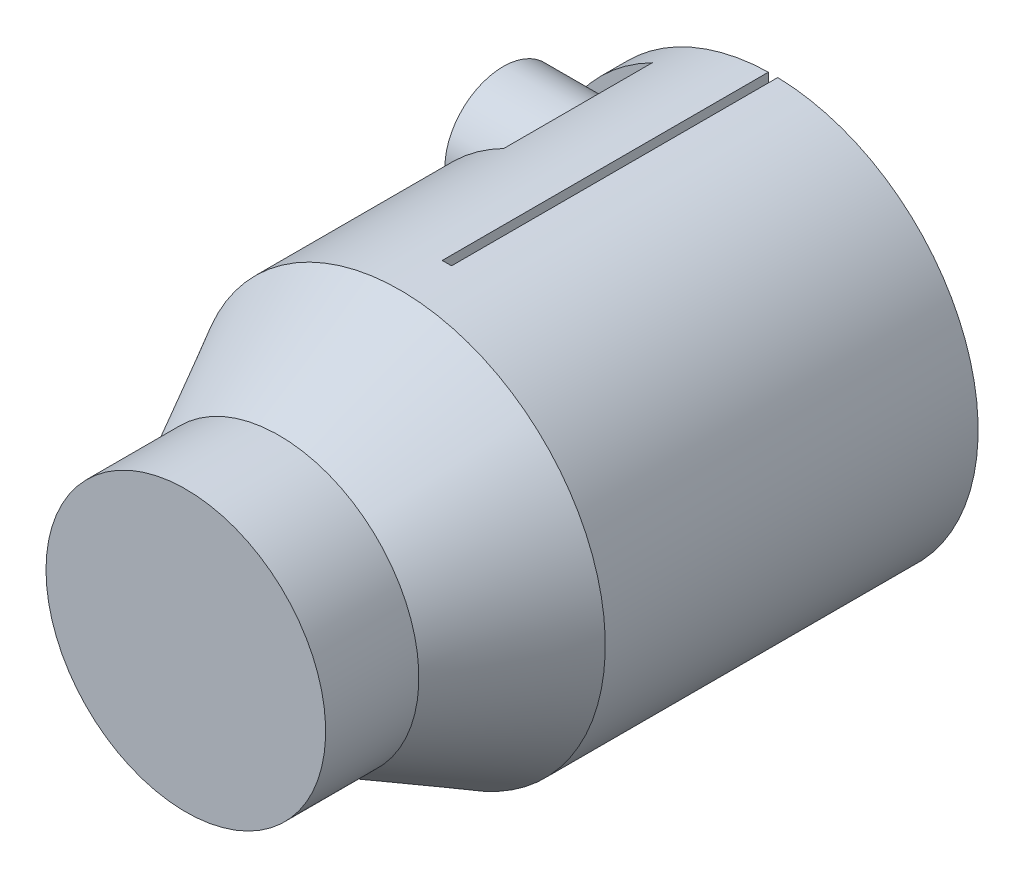
ISO-10303-21;
HEADER;
FILE_DESCRIPTION(('STEP AP214'),'2;1');
FILE_NAME('part.step','',(''),(''),'','','');
FILE_SCHEMA(('AUTOMOTIVE_DESIGN { 1 0 10303 214 1 1 1 1 }'));
ENDSEC;
DATA;
#1=APPLICATION_CONTEXT('core data for automotive mechanical design processes');
#2=APPLICATION_PROTOCOL_DEFINITION('international standard','automotive_design',2000,#1);
#3=PRODUCT_CONTEXT('',#1,'mechanical');
#4=PRODUCT('Part','Part','',(#3));
#5=PRODUCT_RELATED_PRODUCT_CATEGORY('part','',(#4));
#6=PRODUCT_DEFINITION_FORMATION('','',#4);
#7=PRODUCT_DEFINITION_CONTEXT('part definition',#1,'design');
#8=PRODUCT_DEFINITION('design','',#6,#7);
#9=PRODUCT_DEFINITION_SHAPE('','',#8);
#10=(LENGTH_UNIT() NAMED_UNIT(*) SI_UNIT(.MILLI.,.METRE.));
#11=(NAMED_UNIT(*) PLANE_ANGLE_UNIT() SI_UNIT($,.RADIAN.));
#12=(NAMED_UNIT(*) SI_UNIT($,.STERADIAN.) SOLID_ANGLE_UNIT());
#13=UNCERTAINTY_MEASURE_WITH_UNIT(LENGTH_MEASURE(1.E-05),#10,'distance_accuracy_value','');
#14=(GEOMETRIC_REPRESENTATION_CONTEXT(3) GLOBAL_UNCERTAINTY_ASSIGNED_CONTEXT((#13)) GLOBAL_UNIT_ASSIGNED_CONTEXT((#10,
#11,#12)) REPRESENTATION_CONTEXT('',''));
#15=CARTESIAN_POINT('',(0.,0.,0.));
#16=DIRECTION('',(0.,0.,1.));
#17=DIRECTION('',(1.,0.,0.));
#18=AXIS2_PLACEMENT_3D('',#15,#16,#17);
#19=CARTESIAN_POINT('',(22.,0.,0.));
#20=DIRECTION('',(0.,0.,-1.));
#21=DIRECTION('',(-1.,0.,0.));
#22=AXIS2_PLACEMENT_3D('',#19,#20,#21);
#23=CYLINDRICAL_SURFACE('',#22,22.);
#24=DIRECTION('',(0.,0.,-1.));
#25=VECTOR('',#24,1.);
#26=CARTESIAN_POINT('',(22.5,21.9943174479228,0.));
#27=LINE('',#26,#25);
#28=CARTESIAN_POINT('',(22.5,21.9943174479228,35.));
#29=VERTEX_POINT('',#28);
#30=CARTESIAN_POINT('',(22.5,21.9943174479228,0.));
#31=VERTEX_POINT('',#30);
#32=EDGE_CURVE('E290',#29,#31,#27,.T.);
#33=ORIENTED_EDGE('',*,*,#32,.F.);
#34=CARTESIAN_POINT('',(22.,0.,35.));
#35=DIRECTION('',(0.,0.,1.));
#36=DIRECTION('',(1.,0.,0.));
#37=AXIS2_PLACEMENT_3D('',#34,#35,#36);
#38=CIRCLE('',#37,22.);
#39=CARTESIAN_POINT('',(21.5,21.9943174479228,35.));
#40=VERTEX_POINT('',#39);
#41=EDGE_CURVE('E283',#40,#29,#38,.F.);
#42=ORIENTED_EDGE('',*,*,#41,.F.);
#43=DIRECTION('',(0.,0.,-1.));
#44=VECTOR('',#43,1.);
#45=CARTESIAN_POINT('',(21.5,21.9943174479228,0.));
#46=LINE('',#45,#44);
#47=CARTESIAN_POINT('',(21.5,21.9943174479228,0.));
#48=VERTEX_POINT('',#47);
#49=EDGE_CURVE('E286',#48,#40,#46,.F.);
#50=ORIENTED_EDGE('',*,*,#49,.F.);
#51=CARTESIAN_POINT('',(22.,0.,0.));
#52=DIRECTION('',(0.,0.,-1.));
#53=DIRECTION('',(-1.,0.,0.));
#54=AXIS2_PLACEMENT_3D('',#51,#52,#53);
#55=CIRCLE('',#54,22.);
#56=EDGE_CURVE('E271',#31,#48,#55,.T.);
#57=ORIENTED_EDGE('',*,*,#56,.F.);
#58=EDGE_LOOP('',(#33,#42,#50,#57));
#59=FACE_BOUND('',#58,.T.);
#60=CARTESIAN_POINT('',(22.,0.,40.));
#61=DIRECTION('',(0.,0.,-1.));
#62=DIRECTION('',(-1.,0.,0.));
#63=AXIS2_PLACEMENT_3D('',#60,#61,#62);
#64=CIRCLE('',#63,22.);
#65=CARTESIAN_POINT('',(0.,0.,40.));
#66=VERTEX_POINT('',#65);
#67=EDGE_CURVE('E267',#66,#66,#64,.T.);
#68=ORIENTED_EDGE('',*,*,#67,.T.);
#69=EDGE_LOOP('',(#68));
#70=FACE_BOUND('',#69,.T.);
#71=CARTESIAN_POINT('',(22.,0.,18.8950646377356));
#72=DIRECTION('',(0.,0.,-1.));
#73=DIRECTION('',(-1.,0.,0.));
#74=AXIS2_PLACEMENT_3D('',#71,#72,#73);
#75=CIRCLE('',#74,22.);
#76=CARTESIAN_POINT('',(12.,19.5959179422654,18.8950646377356));
#77=VERTEX_POINT('',#76);
#78=CARTESIAN_POINT('',(3.56223858134803,12.0020395712091,18.8950646377356));
#79=VERTEX_POINT('',#78);
#80=EDGE_CURVE('E296',#77,#79,#75,.F.);
#81=ORIENTED_EDGE('',*,*,#80,.T.);
#82=CARTESIAN_POINT('',(3.56223858134803,12.0020395712091,18.8950646377356));
#83=CARTESIAN_POINT('',(3.42984916370471,11.7987247659707,18.8696720212076));
#84=CARTESIAN_POINT('',(3.30130799139479,11.5938382201092,18.8361055566972));
#85=CARTESIAN_POINT('',(3.05242442245975,11.1824331225042,18.7517832631057));
#86=CARTESIAN_POINT('',(2.93208799358666,10.975913502249,18.7010150791766));
#87=CARTESIAN_POINT('',(2.69993492835798,10.5623857842971,18.5812892358979));
#88=CARTESIAN_POINT('',(2.58814700469477,10.3553782578138,18.5122734727424));
#89=CARTESIAN_POINT('',(2.37402617966339,9.94358914281965,18.3555959387874));
#90=CARTESIAN_POINT('',(2.27169100214241,9.73880702897969,18.2679386736025));
#91=CARTESIAN_POINT('',(2.07631465659705,9.33262044797644,18.0732267744861));
#92=CARTESIAN_POINT('',(1.98332056806612,9.13123696914421,17.9660808534114));
#93=CARTESIAN_POINT('',(1.80734653173127,8.73519937733571,17.7327353546143));
#94=CARTESIAN_POINT('',(1.72436747017884,8.5405458609944,17.6065340928647));
#95=CARTESIAN_POINT('',(1.56856656838172,8.16079483211427,17.3358162643469));
#96=CARTESIAN_POINT('',(1.4957234664592,7.97567784550534,17.1913392880179));
#97=CARTESIAN_POINT('',(1.35976135584986,7.6169124074791,16.8846733334175));
#98=CARTESIAN_POINT('',(1.29664133514101,7.4432627635655,16.7224862015057));
#99=CARTESIAN_POINT('',(1.18490560676272,7.12445146449219,16.3966874905089));
#100=CARTESIAN_POINT('',(1.13549984024265,6.97812924129825,16.2344795323216));
#101=CARTESIAN_POINT('',(1.04401033591964,6.69836997797281,15.8973892240503));
#102=CARTESIAN_POINT('',(1.00192619651111,6.5649322312813,15.7225075698891));
#103=CARTESIAN_POINT('',(0.924585261417395,6.31223989636348,15.3612107988862));
#104=CARTESIAN_POINT('',(0.889332294814257,6.19299327706533,15.1747892903991));
#105=CARTESIAN_POINT('',(0.825178845431487,5.96995997839484,14.7918764597282));
#106=CARTESIAN_POINT('',(0.796278338732741,5.86617324081139,14.5953851754638));
#107=CARTESIAN_POINT('',(0.745130836523064,5.67800599345516,14.1999945999284));
#108=CARTESIAN_POINT('',(0.722706524344409,5.59312674966742,14.0013552936403));
#109=CARTESIAN_POINT('',(0.682927563285331,5.43955164379563,13.5973402766854));
#110=CARTESIAN_POINT('',(0.665574759601739,5.37086167370558,13.3919621443452));
#111=CARTESIAN_POINT('',(0.635592938400196,5.25033035180947,12.9761233804645));
#112=CARTESIAN_POINT('',(0.622961008928325,5.19847861635303,12.7656659675319));
#113=CARTESIAN_POINT('',(0.602110567853958,5.11197716378334,12.340931251484));
#114=CARTESIAN_POINT('',(0.593894064791938,5.07733527582584,12.126652255676));
#115=CARTESIAN_POINT('',(0.581648374412549,5.02542843868485,11.6946730600962));
#116=CARTESIAN_POINT('',(0.577642682309074,5.00826100904073,11.4769604723564));
#117=CARTESIAN_POINT('',(0.573797711474712,4.99178597459808,11.0409219007499));
#118=CARTESIAN_POINT('',(0.573956572904074,4.99247039737529,10.8225962342331));
#119=CARTESIAN_POINT('',(0.578441373980471,5.01167865676666,10.3866635701479));
#120=CARTESIAN_POINT('',(0.582769408326811,5.03021146086386,10.1690569890155));
#121=CARTESIAN_POINT('',(0.595703888514974,5.08496776727002,9.73629232964482));
#122=CARTESIAN_POINT('',(0.604308731083153,5.12118464015294,9.52113336474729));
#123=CARTESIAN_POINT('',(0.626048271275328,5.21117413541157,9.09391096768385));
#124=CARTESIAN_POINT('',(0.639199715986966,5.26501162245648,8.88186204424169));
#125=CARTESIAN_POINT('',(0.670331700307662,5.38974750690636,8.46320500433935));
#126=CARTESIAN_POINT('',(0.688312251206693,5.46064594419811,8.25659690060051));
#127=CARTESIAN_POINT('',(0.729483495935026,5.61887936010449,7.85032725241451));
#128=CARTESIAN_POINT('',(0.752673788469355,5.70621307266186,7.6506651742975));
#129=CARTESIAN_POINT('',(0.804703409745069,5.89653529601973,7.25971393730735));
#130=CARTESIAN_POINT('',(0.833542698373498,5.99952369565669,7.06842471899117));
#131=CARTESIAN_POINT('',(0.897176716515441,6.21963827368197,6.6965398235787));
#132=CARTESIAN_POINT('',(0.931940456953628,6.3366899957852,6.5158947721063));
#133=CARTESIAN_POINT('',(1.00798611973251,6.5842319383203,6.16551476089705));
#134=CARTESIAN_POINT('',(1.04926800050181,6.71472207304281,5.99577973158798));
#135=CARTESIAN_POINT('',(1.13877681875256,6.98784717386907,5.66838689999571));
#136=CARTESIAN_POINT('',(1.18700267305319,7.1304802443973,5.51072721996053));
#137=CARTESIAN_POINT('',(1.29077875319465,7.42648938239762,5.20844714308874));
#138=CARTESIAN_POINT('',(1.34632895108119,7.57986540886681,5.06382669648979));
#139=CARTESIAN_POINT('',(1.46484387525406,7.89529263312869,4.78889452836025));
#140=CARTESIAN_POINT('',(1.52778320481087,8.05731312926313,4.65853660757922));
#141=CARTESIAN_POINT('',(1.66140388275251,8.38888854246947,4.41217314663342));
#142=CARTESIAN_POINT('',(1.73208520602999,8.55844343510619,4.29616755992652));
#143=CARTESIAN_POINT('',(1.88125777920852,8.90345609419582,4.07887528410194));
#144=CARTESIAN_POINT('',(1.9597496093537,9.07891429856509,3.97758968991282));
#145=CARTESIAN_POINT('',(2.12447914988019,9.43408670762869,3.78989626175536));
#146=CARTESIAN_POINT('',(2.21071691514845,9.61380094247418,3.70348853322278));
#147=CARTESIAN_POINT('',(2.39410538973551,9.98262806973082,3.54255149536163));
#148=CARTESIAN_POINT('',(2.49154214215537,10.1718424037963,3.46858128714647));
#149=CARTESIAN_POINT('',(2.69426228665945,10.5515314085004,3.33626263666899));
#150=CARTESIAN_POINT('',(2.79954647301394,10.7420062049328,3.27791577846081));
#151=CARTESIAN_POINT('',(3.01755727960109,11.122724165276,3.17635572579952));
#152=CARTESIAN_POINT('',(3.13028431556015,11.3129673156425,3.13314337754808));
#153=CARTESIAN_POINT('',(3.36268231875591,11.6918680044669,3.06122245230201));
#154=CARTESIAN_POINT('',(3.48235154992991,11.8805259259542,3.03251026647592));
#155=CARTESIAN_POINT('',(3.70813354040176,12.224679830949,2.99238339557038));
#156=CARTESIAN_POINT('',(3.81328285944319,12.3805758204604,2.97891405498808));
#157=CARTESIAN_POINT('',(4.02751297825754,12.6895648667716,2.96115443194715));
#158=CARTESIAN_POINT('',(4.13658260312914,12.8426642645159,2.95683988292032));
#159=CARTESIAN_POINT('',(4.24759976615529,12.9943174479228,2.9568416240263));
#160=B_SPLINE_CURVE_WITH_KNOTS('',3,(#82,#83,#84,#85,#86,#87,#88,#89,#90,#91,#92,#93,#94,#95,
#96,#97,#98,#99,#100,#101,#102,#103,#104,#105,#106,#107,#108,#109,#110,#111,#112,#113,#114,#115,
#116,#117,#118,#119,#120,#121,#122,#123,#124,#125,#126,#127,#128,#129,#130,#131,#132,#133,#134,
#135,#136,#137,#138,#139,#140,#141,#142,#143,#144,#145,#146,#147,#148,#149,#150,#151,#152,#153,
#154,#155,#156,#157,#158,#159),.UNSPECIFIED.,.F.,.F.,(4,2,2,2,2,2,2,2,2,2,2,2,2,2,2,2,2,2,2,2,2,
2,2,2,2,2,2,2,2,2,2,2,2,2,2,2,2,2,4),(0.,0.731769595797977,1.46406589094635,2.19872264324119,
2.93320203183385,3.67121481442704,4.40929285756396,5.14579854872543,5.88222752918739,
6.55330516225114,7.22434597377798,7.89576184307923,8.5671751842341,9.2179358956807,
9.8689330833136,10.5195280541515,11.1704187252078,11.8249222232623,12.4791334328713,
13.1336735064844,13.7879683934575,14.4446994703426,15.1014320826136,15.7581141255462,
16.4147915056143,17.0681338897009,17.721472107069,18.3747085212973,19.0279424424376,
19.6789935127648,20.3300424717903,20.9811398335341,21.6322418092546,22.3074811293338,
22.9827888861421,23.6581343947745,24.3333117390354,24.8986037095967,25.4623953814796),.UNSPECIFIED.);
#161=CARTESIAN_POINT('',(4.24759976615529,12.9943174479228,2.9568416240263));
#162=VERTEX_POINT('',#161);
#163=EDGE_CURVE('E51',#79,#162,#160,.T.);
#164=ORIENTED_EDGE('',*,*,#163,.T.);
#165=CARTESIAN_POINT('',(22.,0.,2.9568416240263));
#166=DIRECTION('',(0.,0.,1.));
#167=DIRECTION('',(1.,0.,0.));
#168=AXIS2_PLACEMENT_3D('',#165,#166,#167);
#169=CIRCLE('',#168,22.);
#170=CARTESIAN_POINT('',(12.,19.5959179422654,2.9568416240263));
#171=VERTEX_POINT('',#170);
#172=EDGE_CURVE('E300',#162,#171,#169,.F.);
#173=ORIENTED_EDGE('',*,*,#172,.T.);
#174=DIRECTION('',(0.,0.,-1.));
#175=VECTOR('',#174,1.);
#176=CARTESIAN_POINT('',(12.,19.5959179422654,0.));
#177=LINE('',#176,#175);
#178=EDGE_CURVE('E293',#77,#171,#177,.T.);
#179=ORIENTED_EDGE('',*,*,#178,.F.);
#180=EDGE_LOOP('',(#81,#164,#173,#179));
#181=FACE_BOUND('',#180,.T.);
#182=ADVANCED_FACE('F41',(#59,#70,#181),#23,.T.);
#183=CARTESIAN_POINT('',(0.,0.,40.));
#184=DIRECTION('',(0.,0.,1.));
#185=DIRECTION('',(1.,0.,0.));
#186=AXIS2_PLACEMENT_3D('',#183,#184,#185);
#187=PLANE('',#186);
#188=CARTESIAN_POINT('',(22.,0.,40.));
#189=DIRECTION('',(0.,0.,-1.));
#190=DIRECTION('',(-1.,0.,0.));
#191=AXIS2_PLACEMENT_3D('',#188,#189,#190);
#192=CIRCLE('',#191,7.);
#193=CARTESIAN_POINT('',(15.,0.,40.));
#194=VERTEX_POINT('',#193);
#195=EDGE_CURVE('E279',#194,#194,#192,.T.);
#196=ORIENTED_EDGE('',*,*,#195,.T.);
#197=EDGE_LOOP('',(#196));
#198=FACE_BOUND('',#197,.T.);
#199=ADVANCED_FACE('F43',(#198),#187,.F.);
#200=CARTESIAN_POINT('',(22.,0.,0.));
#201=DIRECTION('',(0.,0.,-1.));
#202=DIRECTION('',(-1.,0.,0.));
#203=AXIS2_PLACEMENT_3D('',#200,#201,#202);
#204=CYLINDRICAL_SURFACE('',#203,7.);
#205=ORIENTED_EDGE('',*,*,#195,.F.);
#206=EDGE_LOOP('',(#205));
#207=FACE_BOUND('',#206,.T.);
#208=CARTESIAN_POINT('',(22.,0.,35.));
#209=DIRECTION('',(0.,0.,1.));
#210=DIRECTION('',(1.,0.,0.));
#211=AXIS2_PLACEMENT_3D('',#208,#209,#210);
#212=CIRCLE('',#211,7.);
#213=CARTESIAN_POINT('',(21.5,6.98212002188447,35.));
#214=VERTEX_POINT('',#213);
#215=CARTESIAN_POINT('',(22.5,6.98212002188447,35.));
#216=VERTEX_POINT('',#215);
#217=EDGE_CURVE('E243',#214,#216,#212,.F.);
#218=ORIENTED_EDGE('',*,*,#217,.T.);
#219=DIRECTION('',(0.,0.,-1.));
#220=VECTOR('',#219,1.);
#221=CARTESIAN_POINT('',(22.5,6.98212002188447,0.));
#222=LINE('',#221,#220);
#223=CARTESIAN_POINT('',(22.5,6.98212002188447,0.));
#224=VERTEX_POINT('',#223);
#225=EDGE_CURVE('E255',#216,#224,#222,.T.);
#226=ORIENTED_EDGE('',*,*,#225,.T.);
#227=CARTESIAN_POINT('',(22.,0.,0.));
#228=DIRECTION('',(0.,0.,-1.));
#229=DIRECTION('',(-1.,0.,0.));
#230=AXIS2_PLACEMENT_3D('',#227,#228,#229);
#231=CIRCLE('',#230,7.);
#232=CARTESIAN_POINT('',(21.5,6.98212002188447,0.));
#233=VERTEX_POINT('',#232);
#234=EDGE_CURVE('E275',#224,#233,#231,.T.);
#235=ORIENTED_EDGE('',*,*,#234,.T.);
#236=DIRECTION('',(0.,0.,-1.));
#237=VECTOR('',#236,1.);
#238=CARTESIAN_POINT('',(21.5,6.98212002188447,0.));
#239=LINE('',#238,#237);
#240=EDGE_CURVE('E251',#233,#214,#239,.F.);
#241=ORIENTED_EDGE('',*,*,#240,.T.);
#242=EDGE_LOOP('',(#218,#226,#235,#241));
#243=FACE_BOUND('',#242,.T.);
#244=ADVANCED_FACE('F349',(#207,#243),#204,.F.);
#245=CARTESIAN_POINT('',(0.,0.,0.));
#246=DIRECTION('',(0.,0.,1.));
#247=DIRECTION('',(1.,0.,0.));
#248=AXIS2_PLACEMENT_3D('',#245,#246,#247);
#249=PLANE('',#248);
#250=ORIENTED_EDGE('',*,*,#234,.F.);
#251=DIRECTION('',(0.,-1.,0.));
#252=VECTOR('',#251,1.);
#253=CARTESIAN_POINT('',(22.5,5.02484007666498,0.));
#254=LINE('',#253,#252);
#255=EDGE_CURVE('E234',#31,#224,#254,.T.);
#256=ORIENTED_EDGE('',*,*,#255,.F.);
#257=ORIENTED_EDGE('',*,*,#56,.T.);
#258=DIRECTION('',(0.,1.,0.));
#259=VECTOR('',#258,1.);
#260=CARTESIAN_POINT('',(21.5,5.02484007666498,0.));
#261=LINE('',#260,#259);
#262=EDGE_CURVE('E240',#233,#48,#261,.T.);
#263=ORIENTED_EDGE('',*,*,#262,.F.);
#264=EDGE_LOOP('',(#250,#256,#257,#263));
#265=FACE_BOUND('',#264,.T.);
#266=ADVANCED_FACE('F344',(#265),#249,.F.);
#267=CARTESIAN_POINT('',(22.,0.,40.));
#268=DIRECTION('',(0.,0.,-1.));
#269=DIRECTION('',(-1.,0.,0.));
#270=AXIS2_PLACEMENT_3D('',#267,#268,#269);
#271=CONICAL_SURFACE('',#270,22.,0.493941368919581);
#272=CARTESIAN_POINT('',(22.,0.,53.));
#273=DIRECTION('',(0.,0.,-1.));
#274=DIRECTION('',(-1.,0.,0.));
#275=AXIS2_PLACEMENT_3D('',#272,#273,#274);
#276=CIRCLE('',#275,15.);
#277=CARTESIAN_POINT('',(7.00000000000001,0.,53.));
#278=VERTEX_POINT('',#277);
#279=EDGE_CURVE('E263',#278,#278,#276,.T.);
#280=ORIENTED_EDGE('',*,*,#279,.T.);
#281=EDGE_LOOP('',(#280));
#282=FACE_BOUND('',#281,.T.);
#283=ORIENTED_EDGE('',*,*,#67,.F.);
#284=EDGE_LOOP('',(#283));
#285=FACE_BOUND('',#284,.T.);
#286=ADVANCED_FACE('F341',(#282,#285),#271,.T.);
#287=CARTESIAN_POINT('',(22.,0.,0.));
#288=DIRECTION('',(0.,0.,-1.));
#289=DIRECTION('',(-1.,0.,0.));
#290=AXIS2_PLACEMENT_3D('',#287,#288,#289);
#291=CYLINDRICAL_SURFACE('',#290,15.);
#292=CARTESIAN_POINT('',(22.,0.,63.));
#293=DIRECTION('',(0.,0.,-1.));
#294=DIRECTION('',(-1.,0.,0.));
#295=AXIS2_PLACEMENT_3D('',#292,#293,#294);
#296=CIRCLE('',#295,15.);
#297=CARTESIAN_POINT('',(7.00000000000001,0.,63.));
#298=VERTEX_POINT('',#297);
#299=EDGE_CURVE('E259',#298,#298,#296,.T.);
#300=ORIENTED_EDGE('',*,*,#299,.T.);
#301=EDGE_LOOP('',(#300));
#302=FACE_BOUND('',#301,.T.);
#303=ORIENTED_EDGE('',*,*,#279,.F.);
#304=EDGE_LOOP('',(#303));
#305=FACE_BOUND('',#304,.T.);
#306=ADVANCED_FACE('F338',(#302,#305),#291,.T.);
#307=CARTESIAN_POINT('',(0.,0.,63.));
#308=DIRECTION('',(0.,0.,1.));
#309=DIRECTION('',(1.,0.,0.));
#310=AXIS2_PLACEMENT_3D('',#307,#308,#309);
#311=PLANE('',#310);
#312=ORIENTED_EDGE('',*,*,#299,.F.);
#313=EDGE_LOOP('',(#312));
#314=FACE_BOUND('',#313,.T.);
#315=ADVANCED_FACE('F334',(#314),#311,.T.);
#316=CARTESIAN_POINT('',(22.5,5.02484007666498,35.));
#317=DIRECTION('',(1.,0.,0.));
#318=DIRECTION('',(0.,0.,-1.));
#319=AXIS2_PLACEMENT_3D('',#316,#317,#318);
#320=PLANE('',#319);
#321=CARTESIAN_POINT('',(22.5,12.9943174479228,10.9568416240263));
#322=DIRECTION('',(1.,0.,0.));
#323=DIRECTION('',(0.,0.,-1.));
#324=AXIS2_PLACEMENT_3D('',#321,#322,#323);
#325=CIRCLE('',#324,4.);
#326=CARTESIAN_POINT('',(22.5,12.9943174479228,6.9568416240263));
#327=VERTEX_POINT('',#326);
#328=EDGE_CURVE('E169',#327,#327,#325,.T.);
#329=ORIENTED_EDGE('',*,*,#328,.T.);
#330=EDGE_LOOP('',(#329));
#331=FACE_BOUND('',#330,.T.);
#332=DIRECTION('',(0.,-1.,0.));
#333=VECTOR('',#332,1.);
#334=CARTESIAN_POINT('',(22.5,5.02484007666498,35.));
#335=LINE('',#334,#333);
#336=EDGE_CURVE('E235',#29,#216,#335,.T.);
#337=ORIENTED_EDGE('',*,*,#336,.F.);
#338=ORIENTED_EDGE('',*,*,#32,.T.);
#339=ORIENTED_EDGE('',*,*,#255,.T.);
#340=ORIENTED_EDGE('',*,*,#225,.F.);
#341=EDGE_LOOP('',(#337,#338,#339,#340));
#342=FACE_BOUND('',#341,.T.);
#343=ADVANCED_FACE('F330',(#331,#342),#320,.F.);
#344=CARTESIAN_POINT('',(21.5,5.02484007666498,35.));
#345=DIRECTION('',(-1.,0.,0.));
#346=DIRECTION('',(0.,0.,1.));
#347=AXIS2_PLACEMENT_3D('',#344,#345,#346);
#348=PLANE('',#347);
#349=CARTESIAN_POINT('',(21.5,12.9943174479228,10.9568416240263));
#350=DIRECTION('',(-1.,0.,0.));
#351=DIRECTION('',(0.,0.,1.));
#352=AXIS2_PLACEMENT_3D('',#349,#350,#351);
#353=CIRCLE('',#352,4.);
#354=CARTESIAN_POINT('',(21.5,12.9943174479228,14.9568416240263));
#355=VERTEX_POINT('',#354);
#356=EDGE_CURVE('E45',#355,#355,#353,.T.);
#357=ORIENTED_EDGE('',*,*,#356,.T.);
#358=EDGE_LOOP('',(#357));
#359=FACE_BOUND('',#358,.T.);
#360=ORIENTED_EDGE('',*,*,#262,.T.);
#361=ORIENTED_EDGE('',*,*,#49,.T.);
#362=DIRECTION('',(0.,1.,0.));
#363=VECTOR('',#362,1.);
#364=CARTESIAN_POINT('',(21.5,5.02484007666498,35.));
#365=LINE('',#364,#363);
#366=EDGE_CURVE('E239',#214,#40,#365,.T.);
#367=ORIENTED_EDGE('',*,*,#366,.F.);
#368=ORIENTED_EDGE('',*,*,#240,.F.);
#369=EDGE_LOOP('',(#360,#361,#367,#368));
#370=FACE_BOUND('',#369,.T.);
#371=ADVANCED_FACE('F326',(#359,#370),#348,.F.);
#372=CARTESIAN_POINT('',(0.,0.,35.));
#373=DIRECTION('',(0.,0.,1.));
#374=DIRECTION('',(1.,0.,0.));
#375=AXIS2_PLACEMENT_3D('',#372,#373,#374);
#376=PLANE('',#375);
#377=ORIENTED_EDGE('',*,*,#366,.T.);
#378=ORIENTED_EDGE('',*,*,#41,.T.);
#379=ORIENTED_EDGE('',*,*,#336,.T.);
#380=ORIENTED_EDGE('',*,*,#217,.F.);
#381=EDGE_LOOP('',(#377,#378,#379,#380));
#382=FACE_BOUND('',#381,.T.);
#383=ADVANCED_FACE('F321',(#382),#376,.F.);
#384=CARTESIAN_POINT('',(12.,12.9943174479228,10.9568416240263));
#385=DIRECTION('',(-1.,0.,0.));
#386=DIRECTION('',(0.,0.,1.));
#387=AXIS2_PLACEMENT_3D('',#384,#385,#386);
#388=CYLINDRICAL_SURFACE('',#387,8.);
#389=DIRECTION('',(-1.,0.,0.));
#390=VECTOR('',#389,1.);
#391=CARTESIAN_POINT('',(12.,12.0020395712091,18.8950646377356));
#392=LINE('',#391,#390);
#393=CARTESIAN_POINT('',(12.,12.0020395712091,18.8950646377356));
#394=VERTEX_POINT('',#393);
#395=EDGE_CURVE('E226',#394,#79,#392,.T.);
#396=ORIENTED_EDGE('',*,*,#395,.F.);
#397=CARTESIAN_POINT('',(12.,12.9943174479228,10.9568416240263));
#398=DIRECTION('',(1.,0.,0.));
#399=DIRECTION('',(0.,0.,-1.));
#400=AXIS2_PLACEMENT_3D('',#397,#398,#399);
#401=CIRCLE('',#400,8.);
#402=CARTESIAN_POINT('',(12.,12.9943174479228,2.9568416240263));
#403=VERTEX_POINT('',#402);
#404=EDGE_CURVE('E216',#394,#403,#401,.T.);
#405=ORIENTED_EDGE('',*,*,#404,.T.);
#406=DIRECTION('',(-1.,0.,0.));
#407=VECTOR('',#406,1.);
#408=CARTESIAN_POINT('',(12.,12.9943174479228,2.9568416240263));
#409=LINE('',#408,#407);
#410=EDGE_CURVE('E230',#403,#162,#409,.T.);
#411=ORIENTED_EDGE('',*,*,#410,.T.);
#412=ORIENTED_EDGE('',*,*,#163,.F.);
#413=EDGE_LOOP('',(#396,#405,#411,#412));
#414=FACE_BOUND('',#413,.T.);
#415=ADVANCED_FACE('F315',(#414),#388,.F.);
#416=CARTESIAN_POINT('',(12.,12.9943174479228,2.9568416240263));
#417=DIRECTION('',(0.,0.,1.));
#418=DIRECTION('',(1.,0.,0.));
#419=AXIS2_PLACEMENT_3D('',#416,#417,#418);
#420=PLANE('',#419);
#421=ORIENTED_EDGE('',*,*,#410,.F.);
#422=DIRECTION('',(0.,1.,0.));
#423=VECTOR('',#422,1.);
#424=CARTESIAN_POINT('',(12.,12.9943174479228,2.9568416240263));
#425=LINE('',#424,#423);
#426=EDGE_CURVE('E220',#403,#171,#425,.T.);
#427=ORIENTED_EDGE('',*,*,#426,.T.);
#428=ORIENTED_EDGE('',*,*,#172,.F.);
#429=EDGE_LOOP('',(#421,#427,#428));
#430=FACE_BOUND('',#429,.T.);
#431=ADVANCED_FACE('F320',(#430),#420,.T.);
#432=CARTESIAN_POINT('',(12.,12.0020395712091,18.8950646377356));
#433=DIRECTION('',(0.,0.,-1.));
#434=DIRECTION('',(-1.,0.,0.));
#435=AXIS2_PLACEMENT_3D('',#432,#433,#434);
#436=PLANE('',#435);
#437=DIRECTION('',(0.,-1.,0.));
#438=VECTOR('',#437,1.);
#439=CARTESIAN_POINT('',(12.,12.0020395712091,18.8950646377356));
#440=LINE('',#439,#438);
#441=EDGE_CURVE('E66',#77,#394,#440,.T.);
#442=ORIENTED_EDGE('',*,*,#441,.T.);
#443=ORIENTED_EDGE('',*,*,#395,.T.);
#444=ORIENTED_EDGE('',*,*,#80,.F.);
#445=EDGE_LOOP('',(#442,#443,#444));
#446=FACE_BOUND('',#445,.T.);
#447=ADVANCED_FACE('F366',(#446),#436,.T.);
#448=CARTESIAN_POINT('',(12.,12.9943174479228,10.9568416240263));
#449=DIRECTION('',(1.,0.,0.));
#450=DIRECTION('',(0.,0.,-1.));
#451=AXIS2_PLACEMENT_3D('',#448,#449,#450);
#452=PLANE('',#451);
#453=CARTESIAN_POINT('',(12.,12.9943174479228,10.9568416240263));
#454=DIRECTION('',(1.,0.,0.));
#455=DIRECTION('',(0.,0.,-1.));
#456=AXIS2_PLACEMENT_3D('',#453,#454,#455);
#457=CIRCLE('',#456,6.25);
#458=CARTESIAN_POINT('',(12.,12.9943174479228,4.7068416240263));
#459=VERTEX_POINT('',#458);
#460=EDGE_CURVE('E11',#459,#459,#457,.F.);
#461=ORIENTED_EDGE('',*,*,#460,.F.);
#462=EDGE_LOOP('',(#461));
#463=FACE_BOUND('',#462,.T.);
#464=ORIENTED_EDGE('',*,*,#178,.T.);
#465=ORIENTED_EDGE('',*,*,#426,.F.);
#466=ORIENTED_EDGE('',*,*,#404,.F.);
#467=ORIENTED_EDGE('',*,*,#441,.F.);
#468=EDGE_LOOP('',(#464,#465,#466,#467));
#469=FACE_BOUND('',#468,.T.);
#470=ADVANCED_FACE('F369',(#463,#469),#452,.F.);
#471=CARTESIAN_POINT('',(3.99999999999998,12.9943174479228,10.9568416240263));
#472=DIRECTION('',(1.,0.,0.));
#473=DIRECTION('',(0.,0.,-1.));
#474=AXIS2_PLACEMENT_3D('',#471,#472,#473);
#475=CYLINDRICAL_SURFACE('',#474,6.25);
#476=CARTESIAN_POINT('',(3.99999999999998,12.9943174479228,10.9568416240263));
#477=DIRECTION('',(-1.,0.,0.));
#478=DIRECTION('',(0.,0.,1.));
#479=AXIS2_PLACEMENT_3D('',#476,#477,#478);
#480=CIRCLE('',#479,6.25);
#481=CARTESIAN_POINT('',(3.99999999999998,12.9943174479228,17.2068416240263));
#482=VERTEX_POINT('',#481);
#483=EDGE_CURVE('E201',#482,#482,#480,.T.);
#484=ORIENTED_EDGE('',*,*,#483,.F.);
#485=EDGE_LOOP('',(#484));
#486=FACE_BOUND('',#485,.T.);
#487=ORIENTED_EDGE('',*,*,#460,.T.);
#488=EDGE_LOOP('',(#487));
#489=FACE_BOUND('',#488,.T.);
#490=ADVANCED_FACE('F378',(#486,#489),#475,.T.);
#491=CARTESIAN_POINT('',(3.99999999999998,12.9943174479228,10.9568416240263));
#492=DIRECTION('',(-1.,0.,0.));
#493=DIRECTION('',(0.,0.,1.));
#494=AXIS2_PLACEMENT_3D('',#491,#492,#493);
#495=PLANE('',#494);
#496=DIRECTION('',(0.,0.75808822379318,0.652152010612634));
#497=VECTOR('',#496,1.);
#498=CARTESIAN_POINT('',(3.99999999999998,9.72481409585543,12.1015458787666));
#499=LINE('',#498,#497);
#500=CARTESIAN_POINT('',(3.99999999999998,9.72481409585543,12.1015458787666));
#501=VERTEX_POINT('',#500);
#502=CARTESIAN_POINT('',(3.99999999999998,12.3509087363143,14.3606667120451));
#503=VERTEX_POINT('',#502);
#504=EDGE_CURVE('E58',#501,#503,#499,.T.);
#505=ORIENTED_EDGE('',*,*,#504,.F.);
#506=DIRECTION('',(0.,-0.185736096423049,0.982599665421034));
#507=VECTOR('',#506,1.);
#508=CARTESIAN_POINT('',(3.99999999999998,10.3682228074639,8.69772079074774));
#509=LINE('',#508,#507);
#510=CARTESIAN_POINT('',(3.99999999999998,10.3682228074639,8.69772079074774));
#511=VERTEX_POINT('',#510);
#512=EDGE_CURVE('E162',#511,#501,#509,.T.);
#513=ORIENTED_EDGE('',*,*,#512,.F.);
#514=DIRECTION('',(0.,-0.94382432021623,0.3304476548084));
#515=VECTOR('',#514,1.);
#516=CARTESIAN_POINT('',(3.99999999999998,13.6377261595312,7.55301653600748));
#517=LINE('',#516,#515);
#518=CARTESIAN_POINT('',(3.99999999999998,13.6377261595312,7.55301653600748));
#519=VERTEX_POINT('',#518);
#520=EDGE_CURVE('E166',#519,#511,#517,.T.);
#521=ORIENTED_EDGE('',*,*,#520,.F.);
#522=DIRECTION('',(0.,-0.75808822379318,-0.652152010612634));
#523=VECTOR('',#522,1.);
#524=CARTESIAN_POINT('',(3.99999999999998,16.2638207999901,9.81213736928603));
#525=LINE('',#524,#523);
#526=CARTESIAN_POINT('',(3.99999999999998,16.2638207999901,9.81213736928603));
#527=VERTEX_POINT('',#526);
#528=EDGE_CURVE('E191',#527,#519,#525,.T.);
#529=ORIENTED_EDGE('',*,*,#528,.F.);
#530=DIRECTION('',(0.,0.185736096423051,-0.982599665421034));
#531=VECTOR('',#530,1.);
#532=CARTESIAN_POINT('',(3.99999999999998,15.6204120883816,13.2159624573049));
#533=LINE('',#532,#531);
#534=CARTESIAN_POINT('',(3.99999999999998,15.6204120883816,13.2159624573049));
#535=VERTEX_POINT('',#534);
#536=EDGE_CURVE('E187',#535,#527,#533,.T.);
#537=ORIENTED_EDGE('',*,*,#536,.F.);
#538=DIRECTION('',(0.,0.94382432021623,-0.3304476548084));
#539=VECTOR('',#538,1.);
#540=CARTESIAN_POINT('',(3.99999999999998,12.3509087363143,14.3606667120451));
#541=LINE('',#540,#539);
#542=EDGE_CURVE('E184',#503,#535,#541,.T.);
#543=ORIENTED_EDGE('',*,*,#542,.F.);
#544=EDGE_LOOP('',(#505,#513,#521,#529,#537,#543));
#545=FACE_BOUND('',#544,.T.);
#546=ORIENTED_EDGE('',*,*,#483,.T.);
#547=EDGE_LOOP('',(#546));
#548=FACE_BOUND('',#547,.T.);
#549=ADVANCED_FACE('F384',(#545,#548),#495,.T.);
#550=CARTESIAN_POINT('',(8.99999999999998,9.72481409585543,12.1015458787666));
#551=DIRECTION('',(0.,-0.652152010612634,0.75808822379318));
#552=DIRECTION('',(0.,-0.758088223793181,-0.652152010612634));
#553=AXIS2_PLACEMENT_3D('',#550,#551,#552);
#554=PLANE('',#553);
#555=ORIENTED_EDGE('',*,*,#504,.T.);
#556=DIRECTION('',(-1.,0.,0.));
#557=VECTOR('',#556,1.);
#558=CARTESIAN_POINT('',(8.99999999999998,12.3509087363143,14.3606667120451));
#559=LINE('',#558,#557);
#560=CARTESIAN_POINT('',(8.99999999999998,12.3509087363143,14.3606667120451));
#561=VERTEX_POINT('',#560);
#562=EDGE_CURVE('E136',#561,#503,#559,.T.);
#563=ORIENTED_EDGE('',*,*,#562,.F.);
#564=DIRECTION('',(0.,0.75808822379318,0.652152010612634));
#565=VECTOR('',#564,1.);
#566=CARTESIAN_POINT('',(8.99999999999998,9.72481409585543,12.1015458787666));
#567=LINE('',#566,#565);
#568=CARTESIAN_POINT('',(8.99999999999998,9.72481409585543,12.1015458787666));
#569=VERTEX_POINT('',#568);
#570=EDGE_CURVE('E140',#569,#561,#567,.T.);
#571=ORIENTED_EDGE('',*,*,#570,.F.);
#572=DIRECTION('',(-1.,0.,0.));
#573=VECTOR('',#572,1.);
#574=CARTESIAN_POINT('',(8.99999999999998,9.72481409585543,12.1015458787666));
#575=LINE('',#574,#573);
#576=EDGE_CURVE('E198',#569,#501,#575,.T.);
#577=ORIENTED_EDGE('',*,*,#576,.T.);
#578=EDGE_LOOP('',(#555,#563,#571,#577));
#579=FACE_BOUND('',#578,.T.);
#580=ADVANCED_FACE('F138',(#579),#554,.F.);
#581=CARTESIAN_POINT('',(8.99999999999998,10.3682228074639,8.69772079074774));
#582=DIRECTION('',(0.,-0.982599665421034,-0.185736096423049));
#583=DIRECTION('',(0.,0.185736096423049,-0.982599665421034));
#584=AXIS2_PLACEMENT_3D('',#581,#582,#583);
#585=PLANE('',#584);
#586=ORIENTED_EDGE('',*,*,#512,.T.);
#587=ORIENTED_EDGE('',*,*,#576,.F.);
#588=DIRECTION('',(0.,-0.185736096423049,0.982599665421034));
#589=VECTOR('',#588,1.);
#590=CARTESIAN_POINT('',(8.99999999999998,10.3682228074639,8.69772079074774));
#591=LINE('',#590,#589);
#592=CARTESIAN_POINT('',(8.99999999999998,10.3682228074639,8.69772079074774));
#593=VERTEX_POINT('',#592);
#594=EDGE_CURVE('E147',#593,#569,#591,.T.);
#595=ORIENTED_EDGE('',*,*,#594,.F.);
#596=DIRECTION('',(-1.,0.,0.));
#597=VECTOR('',#596,1.);
#598=CARTESIAN_POINT('',(8.99999999999998,10.3682228074639,8.69772079074774));
#599=LINE('',#598,#597);
#600=EDGE_CURVE('E202',#593,#511,#599,.T.);
#601=ORIENTED_EDGE('',*,*,#600,.T.);
#602=EDGE_LOOP('',(#586,#587,#595,#601));
#603=FACE_BOUND('',#602,.T.);
#604=ADVANCED_FACE('F391',(#603),#585,.F.);
#605=CARTESIAN_POINT('',(8.99999999999998,13.6377261595312,7.55301653600748));
#606=DIRECTION('',(0.,-0.3304476548084,-0.94382432021623));
#607=DIRECTION('',(0.,0.94382432021623,-0.3304476548084));
#608=AXIS2_PLACEMENT_3D('',#605,#606,#607);
#609=PLANE('',#608);
#610=ORIENTED_EDGE('',*,*,#520,.T.);
#611=ORIENTED_EDGE('',*,*,#600,.F.);
#612=DIRECTION('',(0.,-0.94382432021623,0.3304476548084));
#613=VECTOR('',#612,1.);
#614=CARTESIAN_POINT('',(8.99999999999998,13.6377261595312,7.55301653600748));
#615=LINE('',#614,#613);
#616=CARTESIAN_POINT('',(8.99999999999998,13.6377261595312,7.55301653600748));
#617=VERTEX_POINT('',#616);
#618=EDGE_CURVE('E177',#617,#593,#615,.T.);
#619=ORIENTED_EDGE('',*,*,#618,.F.);
#620=DIRECTION('',(-1.,0.,0.));
#621=VECTOR('',#620,1.);
#622=CARTESIAN_POINT('',(8.99999999999998,13.6377261595312,7.55301653600748));
#623=LINE('',#622,#621);
#624=EDGE_CURVE('E205',#617,#519,#623,.T.);
#625=ORIENTED_EDGE('',*,*,#624,.T.);
#626=EDGE_LOOP('',(#610,#611,#619,#625));
#627=FACE_BOUND('',#626,.T.);
#628=ADVANCED_FACE('F401',(#627),#609,.F.);
#629=CARTESIAN_POINT('',(8.99999999999998,16.2638207999901,9.81213736928603));
#630=DIRECTION('',(0.,0.652152010612634,-0.75808822379318));
#631=DIRECTION('',(0.,0.75808822379318,0.652152010612634));
#632=AXIS2_PLACEMENT_3D('',#629,#630,#631);
#633=PLANE('',#632);
#634=ORIENTED_EDGE('',*,*,#528,.T.);
#635=ORIENTED_EDGE('',*,*,#624,.F.);
#636=DIRECTION('',(0.,-0.75808822379318,-0.652152010612634));
#637=VECTOR('',#636,1.);
#638=CARTESIAN_POINT('',(8.99999999999998,16.2638207999901,9.81213736928603));
#639=LINE('',#638,#637);
#640=CARTESIAN_POINT('',(8.99999999999998,16.2638207999901,9.81213736928603));
#641=VERTEX_POINT('',#640);
#642=EDGE_CURVE('E173',#641,#617,#639,.T.);
#643=ORIENTED_EDGE('',*,*,#642,.F.);
#644=DIRECTION('',(-1.,0.,0.));
#645=VECTOR('',#644,1.);
#646=CARTESIAN_POINT('',(8.99999999999998,16.2638207999901,9.81213736928603));
#647=LINE('',#646,#645);
#648=EDGE_CURVE('E208',#641,#527,#647,.T.);
#649=ORIENTED_EDGE('',*,*,#648,.T.);
#650=EDGE_LOOP('',(#634,#635,#643,#649));
#651=FACE_BOUND('',#650,.T.);
#652=ADVANCED_FACE('F397',(#651),#633,.F.);
#653=CARTESIAN_POINT('',(8.99999999999998,15.6204120883816,13.2159624573049));
#654=DIRECTION('',(0.,0.982599665421034,0.185736096423051));
#655=DIRECTION('',(0.,-0.185736096423051,0.982599665421034));
#656=AXIS2_PLACEMENT_3D('',#653,#654,#655);
#657=PLANE('',#656);
#658=ORIENTED_EDGE('',*,*,#536,.T.);
#659=ORIENTED_EDGE('',*,*,#648,.F.);
#660=DIRECTION('',(0.,0.185736096423051,-0.982599665421034));
#661=VECTOR('',#660,1.);
#662=CARTESIAN_POINT('',(8.99999999999998,15.6204120883816,13.2159624573049));
#663=LINE('',#662,#661);
#664=CARTESIAN_POINT('',(8.99999999999998,15.6204120883816,13.2159624573049));
#665=VERTEX_POINT('',#664);
#666=EDGE_CURVE('E156',#665,#641,#663,.T.);
#667=ORIENTED_EDGE('',*,*,#666,.F.);
#668=DIRECTION('',(-1.,0.,0.));
#669=VECTOR('',#668,1.);
#670=CARTESIAN_POINT('',(8.99999999999998,15.6204120883816,13.2159624573049));
#671=LINE('',#670,#669);
#672=EDGE_CURVE('E146',#665,#535,#671,.T.);
#673=ORIENTED_EDGE('',*,*,#672,.T.);
#674=EDGE_LOOP('',(#658,#659,#667,#673));
#675=FACE_BOUND('',#674,.T.);
#676=ADVANCED_FACE('F394',(#675),#657,.F.);
#677=CARTESIAN_POINT('',(8.99999999999998,12.3509087363143,14.3606667120451));
#678=DIRECTION('',(0.,0.3304476548084,0.94382432021623));
#679=DIRECTION('',(0.,-0.94382432021623,0.3304476548084));
#680=AXIS2_PLACEMENT_3D('',#677,#678,#679);
#681=PLANE('',#680);
#682=ORIENTED_EDGE('',*,*,#542,.T.);
#683=ORIENTED_EDGE('',*,*,#672,.F.);
#684=DIRECTION('',(0.,0.94382432021623,-0.3304476548084));
#685=VECTOR('',#684,1.);
#686=CARTESIAN_POINT('',(8.99999999999998,12.3509087363143,14.3606667120451));
#687=LINE('',#686,#685);
#688=EDGE_CURVE('E150',#561,#665,#687,.T.);
#689=ORIENTED_EDGE('',*,*,#688,.F.);
#690=ORIENTED_EDGE('',*,*,#562,.T.);
#691=EDGE_LOOP('',(#682,#683,#689,#690));
#692=FACE_BOUND('',#691,.T.);
#693=ADVANCED_FACE('F151',(#692),#681,.F.);
#694=CARTESIAN_POINT('',(8.99999999999998,0.,0.));
#695=DIRECTION('',(-1.,0.,0.));
#696=DIRECTION('',(0.,0.,1.));
#697=AXIS2_PLACEMENT_3D('',#694,#695,#696);
#698=PLANE('',#697);
#699=ORIENTED_EDGE('',*,*,#570,.T.);
#700=ORIENTED_EDGE('',*,*,#688,.T.);
#701=ORIENTED_EDGE('',*,*,#666,.T.);
#702=ORIENTED_EDGE('',*,*,#642,.T.);
#703=ORIENTED_EDGE('',*,*,#618,.T.);
#704=ORIENTED_EDGE('',*,*,#594,.T.);
#705=EDGE_LOOP('',(#699,#700,#701,#702,#703,#704));
#706=FACE_BOUND('',#705,.T.);
#707=ADVANCED_FACE('F158',(#706),#698,.T.);
#708=CARTESIAN_POINT('',(32.,12.9943174479228,10.9568416240263));
#709=DIRECTION('',(-1.,0.,0.));
#710=DIRECTION('',(0.,0.,1.));
#711=AXIS2_PLACEMENT_3D('',#708,#709,#710);
#712=CYLINDRICAL_SURFACE('',#711,4.);
#713=ORIENTED_EDGE('',*,*,#356,.F.);
#714=EDGE_LOOP('',(#713));
#715=FACE_BOUND('',#714,.T.);
#716=ORIENTED_EDGE('',*,*,#328,.F.);
#717=EDGE_LOOP('',(#716));
#718=FACE_BOUND('',#717,.T.);
#719=ADVANCED_FACE('F411',(#715,#718),#712,.T.);
#720=CLOSED_SHELL('',(#182,#199,#244,#266,#286,#306,#315,#343,#371,#383,#415,#431,#447,#470,
#490,#549,#580,#604,#628,#652,#676,#693,#707,#719));
#721=MANIFOLD_SOLID_BREP('B2',#720);
#722=ADVANCED_BREP_SHAPE_REPRESENTATION('',(#18,#721),#14);
#723=SHAPE_DEFINITION_REPRESENTATION(#9,#722);
ENDSEC;
END-ISO-10303-21;
